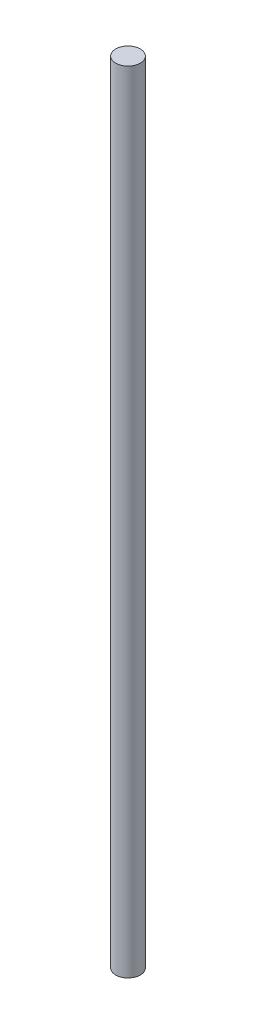
ISO-10303-21;
HEADER;
FILE_DESCRIPTION(('STEP AP214'),'2;1');
FILE_NAME('part.step','',(''),(''),'','','');
FILE_SCHEMA(('AUTOMOTIVE_DESIGN { 1 0 10303 214 1 1 1 1 }'));
ENDSEC;
DATA;
#1=APPLICATION_CONTEXT('core data for automotive mechanical design processes');
#2=APPLICATION_PROTOCOL_DEFINITION('international standard','automotive_design',2000,#1);
#3=PRODUCT_CONTEXT('',#1,'mechanical');
#4=PRODUCT('Part','Part','',(#3));
#5=PRODUCT_RELATED_PRODUCT_CATEGORY('part','',(#4));
#6=PRODUCT_DEFINITION_FORMATION('','',#4);
#7=PRODUCT_DEFINITION_CONTEXT('part definition',#1,'design');
#8=PRODUCT_DEFINITION('design','',#6,#7);
#9=PRODUCT_DEFINITION_SHAPE('','',#8);
#10=(LENGTH_UNIT() NAMED_UNIT(*) SI_UNIT(.MILLI.,.METRE.));
#11=(NAMED_UNIT(*) PLANE_ANGLE_UNIT() SI_UNIT($,.RADIAN.));
#12=(NAMED_UNIT(*) SI_UNIT($,.STERADIAN.) SOLID_ANGLE_UNIT());
#13=UNCERTAINTY_MEASURE_WITH_UNIT(LENGTH_MEASURE(1.E-05),#10,'distance_accuracy_value','');
#14=(GEOMETRIC_REPRESENTATION_CONTEXT(3) GLOBAL_UNCERTAINTY_ASSIGNED_CONTEXT((#13)) GLOBAL_UNIT_ASSIGNED_CONTEXT((#10,
#11,#12)) REPRESENTATION_CONTEXT('',''));
#15=CARTESIAN_POINT('',(0.,0.,0.));
#16=DIRECTION('',(0.,0.,1.));
#17=DIRECTION('',(1.,0.,0.));
#18=AXIS2_PLACEMENT_3D('',#15,#16,#17);
#19=CARTESIAN_POINT('',(0.,152.4,0.));
#20=DIRECTION('',(0.,-1.,0.));
#21=DIRECTION('',(0.,0.,-1.));
#22=AXIS2_PLACEMENT_3D('',#19,#20,#21);
#23=CYLINDRICAL_SURFACE('',#22,2.375);
#24=CARTESIAN_POINT('',(0.,152.4,0.));
#25=DIRECTION('',(0.,1.,0.));
#26=DIRECTION('',(0.,0.,1.));
#27=AXIS2_PLACEMENT_3D('',#24,#25,#26);
#28=CIRCLE('',#27,2.375);
#29=CARTESIAN_POINT('',(0.,152.4,-2.375));
#30=VERTEX_POINT('',#29);
#31=EDGE_CURVE('E12',#30,#30,#28,.T.);
#32=CARTESIAN_POINT('',(0.,0.,0.));
#33=DIRECTION('',(0.,1.,0.));
#34=DIRECTION('',(0.,0.,1.));
#35=AXIS2_PLACEMENT_3D('',#32,#33,#34);
#36=CIRCLE('',#35,2.375);
#37=CARTESIAN_POINT('',(0.,0.,-2.375));
#38=VERTEX_POINT('',#37);
#39=EDGE_CURVE('E46',#38,#38,#36,.T.);
#40=CARTESIAN_POINT('',(0.,152.4,-2.375));
#41=CARTESIAN_POINT('',(0.,150.8125,-2.375));
#42=CARTESIAN_POINT('',(0.,149.225,-2.375));
#43=CARTESIAN_POINT('',(0.,146.05,-2.375));
#44=CARTESIAN_POINT('',(0.,144.4625,-2.375));
#45=CARTESIAN_POINT('',(0.,141.2875,-2.375));
#46=CARTESIAN_POINT('',(0.,139.7,-2.375));
#47=CARTESIAN_POINT('',(0.,136.525,-2.375));
#48=CARTESIAN_POINT('',(0.,134.9375,-2.375));
#49=CARTESIAN_POINT('',(0.,131.7625,-2.375));
#50=CARTESIAN_POINT('',(0.,130.175,-2.375));
#51=CARTESIAN_POINT('',(0.,127.,-2.375));
#52=CARTESIAN_POINT('',(0.,125.4125,-2.375));
#53=CARTESIAN_POINT('',(0.,122.2375,-2.375));
#54=CARTESIAN_POINT('',(0.,120.65,-2.375));
#55=CARTESIAN_POINT('',(0.,117.475,-2.375));
#56=CARTESIAN_POINT('',(0.,115.8875,-2.375));
#57=CARTESIAN_POINT('',(0.,112.7125,-2.375));
#58=CARTESIAN_POINT('',(0.,111.125,-2.375));
#59=CARTESIAN_POINT('',(0.,107.95,-2.375));
#60=CARTESIAN_POINT('',(0.,106.3625,-2.375));
#61=CARTESIAN_POINT('',(0.,103.1875,-2.375));
#62=CARTESIAN_POINT('',(0.,101.6,-2.375));
#63=CARTESIAN_POINT('',(0.,98.425,-2.375));
#64=CARTESIAN_POINT('',(0.,96.8375,-2.375));
#65=CARTESIAN_POINT('',(0.,93.6625,-2.375));
#66=CARTESIAN_POINT('',(0.,92.075,-2.375));
#67=CARTESIAN_POINT('',(0.,88.9,-2.375));
#68=CARTESIAN_POINT('',(0.,87.3125,-2.375));
#69=CARTESIAN_POINT('',(0.,84.1375,-2.375));
#70=CARTESIAN_POINT('',(0.,82.55,-2.375));
#71=CARTESIAN_POINT('',(0.,79.375,-2.375));
#72=CARTESIAN_POINT('',(0.,77.7875,-2.375));
#73=CARTESIAN_POINT('',(0.,74.6125,-2.375));
#74=CARTESIAN_POINT('',(0.,73.025,-2.375));
#75=CARTESIAN_POINT('',(0.,69.85,-2.375));
#76=CARTESIAN_POINT('',(0.,68.2625,-2.375));
#77=CARTESIAN_POINT('',(0.,65.0875,-2.375));
#78=CARTESIAN_POINT('',(0.,63.5,-2.375));
#79=CARTESIAN_POINT('',(0.,60.325,-2.375));
#80=CARTESIAN_POINT('',(0.,58.7375,-2.375));
#81=CARTESIAN_POINT('',(0.,55.5625,-2.375));
#82=CARTESIAN_POINT('',(0.,53.975,-2.375));
#83=CARTESIAN_POINT('',(0.,50.8,-2.375));
#84=CARTESIAN_POINT('',(0.,49.2125,-2.375));
#85=CARTESIAN_POINT('',(0.,46.0375,-2.375));
#86=CARTESIAN_POINT('',(0.,44.45,-2.375));
#87=CARTESIAN_POINT('',(0.,41.275,-2.375));
#88=CARTESIAN_POINT('',(0.,39.6875,-2.375));
#89=CARTESIAN_POINT('',(0.,36.5125,-2.375));
#90=CARTESIAN_POINT('',(0.,34.925,-2.375));
#91=CARTESIAN_POINT('',(0.,31.75,-2.375));
#92=CARTESIAN_POINT('',(0.,30.1625,-2.375));
#93=CARTESIAN_POINT('',(0.,26.9875,-2.375));
#94=CARTESIAN_POINT('',(0.,25.4,-2.375));
#95=CARTESIAN_POINT('',(0.,22.225,-2.375));
#96=CARTESIAN_POINT('',(0.,20.6375,-2.375));
#97=CARTESIAN_POINT('',(0.,17.4625,-2.375));
#98=CARTESIAN_POINT('',(0.,15.875,-2.375));
#99=CARTESIAN_POINT('',(0.,12.7,-2.375));
#100=CARTESIAN_POINT('',(0.,11.1125,-2.375));
#101=CARTESIAN_POINT('',(0.,7.93750000000001,-2.375));
#102=CARTESIAN_POINT('',(0.,6.35,-2.375));
#103=CARTESIAN_POINT('',(0.,3.175,-2.375));
#104=CARTESIAN_POINT('',(0.,1.5875,-2.375));
#105=CARTESIAN_POINT('',(0.,0.,-2.375));
#106=B_SPLINE_CURVE_WITH_KNOTS('',3,(#40,#41,#42,#43,#44,#45,#46,#47,#48,#49,#50,#51,#52,#53,
#54,#55,#56,#57,#58,#59,#60,#61,#62,#63,#64,#65,#66,#67,#68,#69,#70,#71,#72,#73,#74,#75,#76,#77,
#78,#79,#80,#81,#82,#83,#84,#85,#86,#87,#88,#89,#90,#91,#92,#93,#94,#95,#96,#97,#98,#99,#100,
#101,#102,#103,#104,#105),.UNSPECIFIED.,.F.,.F.,(4,2,2,2,2,2,2,2,2,2,2,2,2,2,2,2,2,2,2,2,2,2,2,
2,2,2,2,2,2,2,2,2,4),(0.,4.7625,9.52500000000001,14.2875,19.05,23.8125,28.575,33.3375,38.1,
42.8625,47.625,52.3875,57.15,61.9125,66.675,71.4375,76.2,80.9625,85.725,90.4875,95.25,100.0125,
104.775,109.5375,114.3,119.0625,123.825,128.5875,133.35,138.1125,142.875,147.6375,152.4),.UNSPECIFIED.);
#107=EDGE_CURVE('BSEAM43',#30,#38,#106,.T.);
#108=ORIENTED_EDGE('',*,*,#31,.F.);
#109=ORIENTED_EDGE('',*,*,#39,.T.);
#110=ORIENTED_EDGE('',*,*,#107,.T.);
#111=ORIENTED_EDGE('',*,*,#107,.F.);
#112=EDGE_LOOP('',(#108,#110,#109,#111));
#113=FACE_BOUND('',#112,.T.);
#114=ADVANCED_FACE('F43',(#113),#23,.T.);
#115=CARTESIAN_POINT('',(0.,152.4,0.));
#116=DIRECTION('',(0.,1.,0.));
#117=DIRECTION('',(0.,0.,1.));
#118=AXIS2_PLACEMENT_3D('',#115,#116,#117);
#119=PLANE('',#118);
#120=ORIENTED_EDGE('',*,*,#31,.T.);
#121=EDGE_LOOP('',(#120));
#122=FACE_BOUND('',#121,.T.);
#123=ADVANCED_FACE('F58',(#122),#119,.T.);
#124=CARTESIAN_POINT('',(0.,0.,0.));
#125=DIRECTION('',(0.,1.,0.));
#126=DIRECTION('',(0.,0.,1.));
#127=AXIS2_PLACEMENT_3D('',#124,#125,#126);
#128=PLANE('',#127);
#129=ORIENTED_EDGE('',*,*,#39,.F.);
#130=EDGE_LOOP('',(#129));
#131=FACE_BOUND('',#130,.T.);
#132=ADVANCED_FACE('F56',(#131),#128,.F.);
#133=CLOSED_SHELL('',(#114,#123,#132));
#134=MANIFOLD_SOLID_BREP('B2',#133);
#135=ADVANCED_BREP_SHAPE_REPRESENTATION('',(#18,#134),#14);
#136=SHAPE_DEFINITION_REPRESENTATION(#9,#135);
ENDSEC;
END-ISO-10303-21;
